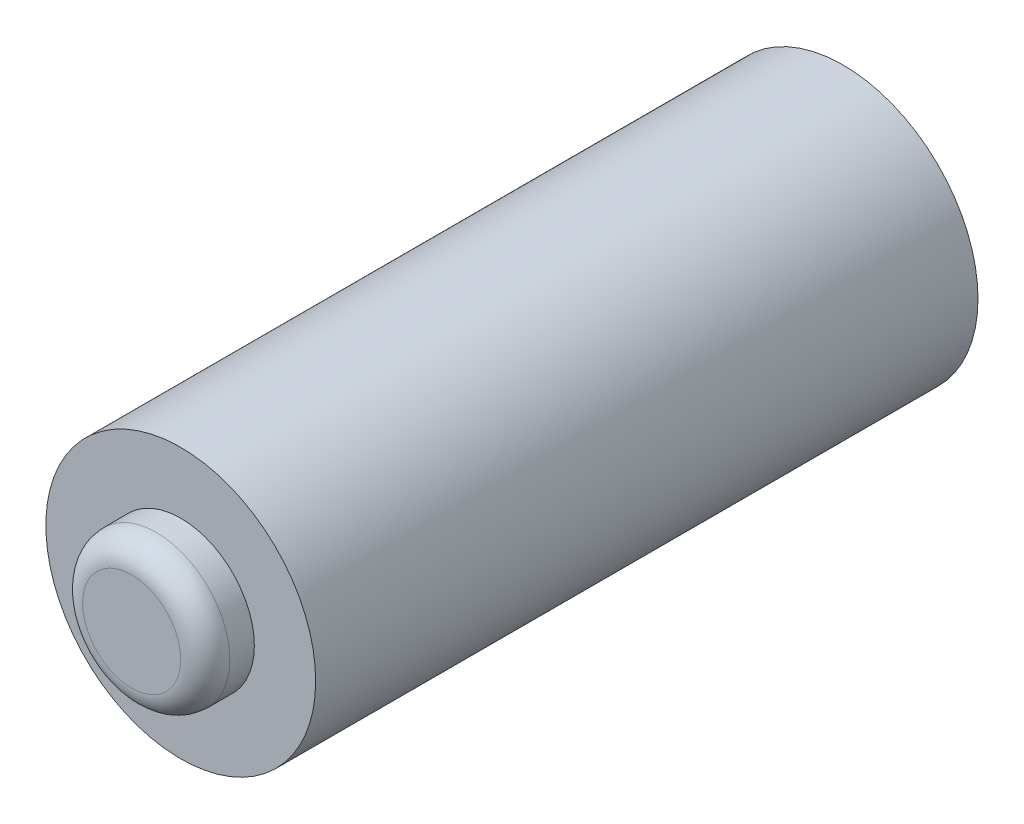
ISO-10303-21;
HEADER;
FILE_DESCRIPTION(('STEP AP214'),'2;1');
FILE_NAME('part.step','',(''),(''),'','','');
FILE_SCHEMA(('AUTOMOTIVE_DESIGN { 1 0 10303 214 1 1 1 1 }'));
ENDSEC;
DATA;
#1=APPLICATION_CONTEXT('core data for automotive mechanical design processes');
#2=APPLICATION_PROTOCOL_DEFINITION('international standard','automotive_design',2000,#1);
#3=PRODUCT_CONTEXT('',#1,'mechanical');
#4=PRODUCT('Part','Part','',(#3));
#5=PRODUCT_RELATED_PRODUCT_CATEGORY('part','',(#4));
#6=PRODUCT_DEFINITION_FORMATION('','',#4);
#7=PRODUCT_DEFINITION_CONTEXT('part definition',#1,'design');
#8=PRODUCT_DEFINITION('design','',#6,#7);
#9=PRODUCT_DEFINITION_SHAPE('','',#8);
#10=(LENGTH_UNIT() NAMED_UNIT(*) SI_UNIT(.MILLI.,.METRE.));
#11=(NAMED_UNIT(*) PLANE_ANGLE_UNIT() SI_UNIT($,.RADIAN.));
#12=(NAMED_UNIT(*) SI_UNIT($,.STERADIAN.) SOLID_ANGLE_UNIT());
#13=UNCERTAINTY_MEASURE_WITH_UNIT(LENGTH_MEASURE(1.E-05),#10,'distance_accuracy_value','');
#14=(GEOMETRIC_REPRESENTATION_CONTEXT(3) GLOBAL_UNCERTAINTY_ASSIGNED_CONTEXT((#13)) GLOBAL_UNIT_ASSIGNED_CONTEXT((#10,
#11,#12)) REPRESENTATION_CONTEXT('',''));
#15=CARTESIAN_POINT('',(0.,0.,0.));
#16=DIRECTION('',(0.,0.,1.));
#17=DIRECTION('',(1.,0.,0.));
#18=AXIS2_PLACEMENT_3D('',#15,#16,#17);
#19=CARTESIAN_POINT('',(0.,0.,13.5));
#20=DIRECTION('',(0.,0.,-1.));
#21=DIRECTION('',(-1.,0.,0.));
#22=AXIS2_PLACEMENT_3D('',#19,#20,#21);
#23=CYLINDRICAL_SURFACE('',#22,2.75);
#24=CARTESIAN_POINT('',(0.,0.,13.5));
#25=DIRECTION('',(0.,0.,1.));
#26=DIRECTION('',(1.,0.,0.));
#27=AXIS2_PLACEMENT_3D('',#24,#25,#26);
#28=CIRCLE('',#27,2.75);
#29=CARTESIAN_POINT('',(2.75,0.,13.5));
#30=VERTEX_POINT('',#29);
#31=EDGE_CURVE('E80',#30,#30,#28,.T.);
#32=ORIENTED_EDGE('',*,*,#31,.F.);
#33=EDGE_LOOP('',(#32));
#34=FACE_BOUND('',#33,.T.);
#35=CARTESIAN_POINT('',(0.,0.,0.));
#36=DIRECTION('',(0.,0.,1.));
#37=DIRECTION('',(1.,0.,0.));
#38=AXIS2_PLACEMENT_3D('',#35,#36,#37);
#39=CIRCLE('',#38,2.75);
#40=CARTESIAN_POINT('',(2.75,0.,0.));
#41=VERTEX_POINT('',#40);
#42=EDGE_CURVE('E84',#41,#41,#39,.T.);
#43=ORIENTED_EDGE('',*,*,#42,.T.);
#44=EDGE_LOOP('',(#43));
#45=FACE_BOUND('',#44,.T.);
#46=ADVANCED_FACE('F42',(#34,#45),#23,.T.);
#47=CARTESIAN_POINT('',(0.,0.,13.5));
#48=DIRECTION('',(0.,0.,1.));
#49=DIRECTION('',(1.,0.,0.));
#50=AXIS2_PLACEMENT_3D('',#47,#48,#49);
#51=PLANE('',#50);
#52=CARTESIAN_POINT('',(0.,0.,13.5));
#53=DIRECTION('',(0.,0.,1.));
#54=DIRECTION('',(1.,0.,0.));
#55=AXIS2_PLACEMENT_3D('',#52,#53,#54);
#56=CIRCLE('',#55,1.5);
#57=CARTESIAN_POINT('',(1.5,0.,13.5));
#58=VERTEX_POINT('',#57);
#59=EDGE_CURVE('E76',#58,#58,#56,.T.);
#60=ORIENTED_EDGE('',*,*,#59,.F.);
#61=EDGE_LOOP('',(#60));
#62=FACE_BOUND('',#61,.T.);
#63=ORIENTED_EDGE('',*,*,#31,.T.);
#64=EDGE_LOOP('',(#63));
#65=FACE_BOUND('',#64,.T.);
#66=ADVANCED_FACE('F117',(#62,#65),#51,.T.);
#67=CARTESIAN_POINT('',(0.,0.,0.));
#68=DIRECTION('',(0.,0.,1.));
#69=DIRECTION('',(1.,0.,0.));
#70=AXIS2_PLACEMENT_3D('',#67,#68,#69);
#71=PLANE('',#70);
#72=CARTESIAN_POINT('',(0.,0.,0.));
#73=DIRECTION('',(0.,0.,-1.));
#74=DIRECTION('',(-1.,0.,0.));
#75=AXIS2_PLACEMENT_3D('',#72,#73,#74);
#76=CIRCLE('',#75,1.5);
#77=CARTESIAN_POINT('',(-1.5,0.,0.));
#78=VERTEX_POINT('',#77);
#79=EDGE_CURVE('E62',#78,#78,#76,.T.);
#80=ORIENTED_EDGE('',*,*,#79,.F.);
#81=EDGE_LOOP('',(#80));
#82=FACE_BOUND('',#81,.T.);
#83=ORIENTED_EDGE('',*,*,#42,.F.);
#84=EDGE_LOOP('',(#83));
#85=FACE_BOUND('',#84,.T.);
#86=ADVANCED_FACE('F115',(#82,#85),#71,.F.);
#87=CARTESIAN_POINT('',(0.,0.,14.5));
#88=DIRECTION('',(0.,0.,-1.));
#89=DIRECTION('',(-1.,0.,0.));
#90=AXIS2_PLACEMENT_3D('',#87,#88,#89);
#91=CYLINDRICAL_SURFACE('',#90,1.5);
#92=CARTESIAN_POINT('',(1.5,0.,14.));
#93=CARTESIAN_POINT('',(1.5,0.196349526304931,14.));
#94=CARTESIAN_POINT('',(1.46095900943656,0.392621839976234,14.));
#95=CARTESIAN_POINT('',(1.3106795880973,0.755428457119036,14.));
#96=CARTESIAN_POINT('',(1.19950025331284,0.9218200902468,14.));
#97=CARTESIAN_POINT('',(0.9218200902468,1.19950025331284,14.));
#98=CARTESIAN_POINT('',(0.7554284571191,1.31067958809728,14.));
#99=CARTESIAN_POINT('',(0.392621839976168,1.46095900943658,14.));
#100=CARTESIAN_POINT('',(0.196349526304952,1.5,14.));
#101=CARTESIAN_POINT('',(-0.196349526304952,1.5,14.));
#102=CARTESIAN_POINT('',(-0.392621839976203,1.46095900943657,14.));
#103=CARTESIAN_POINT('',(-0.755428457119068,1.31067958809729,14.));
#104=CARTESIAN_POINT('',(-0.92182009024681,1.19950025331283,14.));
#105=CARTESIAN_POINT('',(-1.19950025331283,0.921820090246809,14.));
#106=CARTESIAN_POINT('',(-1.31067958809729,0.755428457119068,14.));
#107=CARTESIAN_POINT('',(-1.46095900943657,0.392621839976206,14.));
#108=CARTESIAN_POINT('',(-1.5,0.196349526305006,14.));
#109=CARTESIAN_POINT('',(-1.5,-0.196349526305006,14.));
#110=CARTESIAN_POINT('',(-1.46095900943657,-0.392621839976208,14.));
#111=CARTESIAN_POINT('',(-1.3106795880973,-0.755428457119058,14.));
#112=CARTESIAN_POINT('',(-1.19950025331282,-0.921820090246821,14.));
#113=CARTESIAN_POINT('',(-0.921820090246818,-1.19950025331282,14.));
#114=CARTESIAN_POINT('',(-0.755428457119058,-1.3106795880973,14.));
#115=CARTESIAN_POINT('',(-0.392621839976214,-1.46095900943656,14.));
#116=CARTESIAN_POINT('',(-0.196349526304949,-1.5,14.));
#117=CARTESIAN_POINT('',(0.196349526304955,-1.5,14.));
#118=CARTESIAN_POINT('',(0.392621839976217,-1.46095900943656,14.));
#119=CARTESIAN_POINT('',(0.755428457119049,-1.3106795880973,14.));
#120=CARTESIAN_POINT('',(0.921820090246828,-1.19950025331281,14.));
#121=CARTESIAN_POINT('',(1.19950025331281,-0.921820090246834,14.));
#122=CARTESIAN_POINT('',(1.31067958809729,-0.755428457119069,14.));
#123=CARTESIAN_POINT('',(1.46095900943657,-0.392621839976204,14.));
#124=CARTESIAN_POINT('',(1.5,-0.19634952630493,14.));
#125=CARTESIAN_POINT('',(1.5,0.,14.));
#126=(BOUNDED_CURVE() B_SPLINE_CURVE(3,(#92,#93,#94,#95,#96,#97,#98,#99,#100,#101,#102,#103,
#104,#105,#106,#107,#108,#109,#110,#111,#112,#113,#114,#115,#116,#117,#118,#119,#120,#121,#122,
#123,#124,#125),.UNSPECIFIED.,.T.,.F.) B_SPLINE_CURVE_WITH_KNOTS((4,2,2,2,2,2,2,2,2,2,2,2,2,2,2,
2,4),(0.,0.392699081698724,0.785398163397448,1.17809724509617,1.5707963267949,1.96349540849362,
2.35619449019234,2.74889357189107,3.14159265358979,3.53429173528852,3.92699081698724,
4.31968989868597,4.71238898038469,5.10508806208341,5.49778714378214,5.89048622548086,
6.28318530717959),
.UNSPECIFIED.) CURVE() GEOMETRIC_REPRESENTATION_ITEM() RATIONAL_B_SPLINE_CURVE((1.,1.,1.,1.,1.,
1.,1.,1.,1.,1.,1.,1.,1.,1.,1.,1.,1.,1.,1.,1.,1.,1.,1.,1.,1.,1.,1.,1.,1.,1.,1.,1.,1.,1.)) REPRESENTATION_ITEM(''));
#127=CARTESIAN_POINT('',(1.5,0.,14.));
#128=VERTEX_POINT('',#127);
#129=EDGE_CURVE('E68',#128,#128,#126,.F.);
#130=ORIENTED_EDGE('',*,*,#129,.T.);
#131=EDGE_LOOP('',(#130));
#132=FACE_BOUND('',#131,.T.);
#133=ORIENTED_EDGE('',*,*,#59,.T.);
#134=EDGE_LOOP('',(#133));
#135=FACE_BOUND('',#134,.T.);
#136=ADVANCED_FACE('F108',(#132,#135),#91,.T.);
#137=CARTESIAN_POINT('',(0.,0.,14.5));
#138=DIRECTION('',(0.,0.,1.));
#139=DIRECTION('',(1.,0.,0.));
#140=AXIS2_PLACEMENT_3D('',#137,#138,#139);
#141=PLANE('',#140);
#142=CARTESIAN_POINT('',(1.,0.,14.5));
#143=CARTESIAN_POINT('',(0.999999999999958,-0.130899684203318,14.5));
#144=CARTESIAN_POINT('',(0.973972672957702,-0.261747893317466,14.5));
#145=CARTESIAN_POINT('',(0.873786392064871,-0.503618971412716,14.5));
#146=CARTESIAN_POINT('',(0.799666835541869,-0.614546726831226,14.5));
#147=CARTESIAN_POINT('',(0.614546726831222,-0.799666835541873,14.5));
#148=CARTESIAN_POINT('',(0.503618971412708,-0.873786392064872,14.5));
#149=CARTESIAN_POINT('',(0.261747893317469,-0.973972672957703,14.5));
#150=CARTESIAN_POINT('',(0.130899684203303,-1.,14.5));
#151=CARTESIAN_POINT('',(-0.1308996842033,-1.,14.5));
#152=CARTESIAN_POINT('',(-0.261747893317472,-0.973972672957724,14.5));
#153=CARTESIAN_POINT('',(-0.503618971412711,-0.873786392064849,14.5));
#154=CARTESIAN_POINT('',(-0.614546726831213,-0.799666835541872,14.5));
#155=CARTESIAN_POINT('',(-0.799666835541882,-0.614546726831224,14.5));
#156=CARTESIAN_POINT('',(-0.873786392064861,-0.503618971412703,14.5));
#157=CARTESIAN_POINT('',(-0.973972672957714,-0.261747893317474,14.5));
#158=CARTESIAN_POINT('',(-1.,-0.130899684203301,14.5));
#159=CARTESIAN_POINT('',(-1.,0.130899684203301,14.5));
#160=CARTESIAN_POINT('',(-0.973972672957723,0.261747893317477,14.5));
#161=CARTESIAN_POINT('',(-0.873786392064849,0.503618971412705,14.5));
#162=CARTESIAN_POINT('',(-0.799666835541883,0.614546726831213,14.5));
#163=CARTESIAN_POINT('',(-0.614546726831214,0.799666835541882,14.5));
#164=CARTESIAN_POINT('',(-0.50361897141272,0.873786392064871,14.5));
#165=CARTESIAN_POINT('',(-0.26174789331746,0.973972672957703,14.5));
#166=CARTESIAN_POINT('',(-0.130899684203301,1.,14.5));
#167=CARTESIAN_POINT('',(0.130899684203301,1.,14.5));
#168=CARTESIAN_POINT('',(0.261747893317465,0.973972672957724,14.5));
#169=CARTESIAN_POINT('',(0.503618971412714,0.87378639206485,14.5));
#170=CARTESIAN_POINT('',(0.614546726831229,0.799666835541888,14.5));
#171=CARTESIAN_POINT('',(0.799666835541867,0.614546726831207,14.5));
#172=CARTESIAN_POINT('',(0.873786392064875,0.50361897141271,14.5));
#173=CARTESIAN_POINT('',(0.973972672957699,0.26174789331747,14.5));
#174=CARTESIAN_POINT('',(1.00000000000004,0.130899684203318,14.5));
#175=CARTESIAN_POINT('',(1.,0.,14.5));
#176=(BOUNDED_CURVE() B_SPLINE_CURVE(3,(#142,#143,#144,#145,#146,#147,#148,#149,#150,#151,#152,
#153,#154,#155,#156,#157,#158,#159,#160,#161,#162,#163,#164,#165,#166,#167,#168,#169,#170,#171,
#172,#173,#174,#175),.UNSPECIFIED.,.T.,.F.) B_SPLINE_CURVE_WITH_KNOTS((4,2,2,2,2,2,2,2,2,2,2,2,
2,2,2,2,4),(0.,0.392699081698725,0.785398163397448,1.17809724509617,1.5707963267949,
1.96349540849362,2.35619449019234,2.74889357189107,3.14159265358979,3.53429173528852,
3.92699081698724,4.31968989868597,4.71238898038469,5.10508806208341,5.49778714378214,
5.89048622548086,6.28318530717959),
.UNSPECIFIED.) CURVE() GEOMETRIC_REPRESENTATION_ITEM() RATIONAL_B_SPLINE_CURVE((1.,1.,1.,1.,1.,
1.,1.,1.,1.,1.,1.,1.,1.,1.,1.,1.,1.,1.,1.,1.,1.,1.,1.,1.,1.,1.,1.,1.,1.,1.,1.,1.,1.,1.)) REPRESENTATION_ITEM(''));
#177=CARTESIAN_POINT('',(1.,0.,14.5));
#178=VERTEX_POINT('',#177);
#179=EDGE_CURVE('E74',#178,#178,#176,.F.);
#180=ORIENTED_EDGE('',*,*,#179,.T.);
#181=EDGE_LOOP('',(#180));
#182=FACE_BOUND('',#181,.T.);
#183=ADVANCED_FACE('F97',(#182),#141,.T.);
#184=CARTESIAN_POINT('',(1.,0.,14.5));
#185=CARTESIAN_POINT('',(1.00000000000004,0.130899684203318,14.5));
#186=CARTESIAN_POINT('',(0.973972672957699,0.26174789331747,14.5));
#187=CARTESIAN_POINT('',(0.873786392064875,0.50361897141271,14.5));
#188=CARTESIAN_POINT('',(0.799666835541867,0.614546726831207,14.5));
#189=CARTESIAN_POINT('',(0.614546726831229,0.799666835541888,14.5));
#190=CARTESIAN_POINT('',(0.503618971412714,0.87378639206485,14.5));
#191=CARTESIAN_POINT('',(0.261747893317465,0.973972672957724,14.5));
#192=CARTESIAN_POINT('',(0.130899684203301,1.,14.5));
#193=CARTESIAN_POINT('',(-0.130899684203301,1.,14.5));
#194=CARTESIAN_POINT('',(-0.26174789331746,0.973972672957703,14.5));
#195=CARTESIAN_POINT('',(-0.50361897141272,0.873786392064871,14.5));
#196=CARTESIAN_POINT('',(-0.614546726831214,0.799666835541882,14.5));
#197=CARTESIAN_POINT('',(-0.799666835541883,0.614546726831213,14.5));
#198=CARTESIAN_POINT('',(-0.873786392064849,0.503618971412705,14.5));
#199=CARTESIAN_POINT('',(-0.973972672957723,0.261747893317477,14.5));
#200=CARTESIAN_POINT('',(-1.,0.130899684203301,14.5));
#201=CARTESIAN_POINT('',(-1.,-0.130899684203301,14.5));
#202=CARTESIAN_POINT('',(-0.973972672957714,-0.261747893317474,14.5));
#203=CARTESIAN_POINT('',(-0.873786392064861,-0.503618971412703,14.5));
#204=CARTESIAN_POINT('',(-0.799666835541882,-0.614546726831224,14.5));
#205=CARTESIAN_POINT('',(-0.614546726831213,-0.799666835541872,14.5));
#206=CARTESIAN_POINT('',(-0.503618971412711,-0.873786392064849,14.5));
#207=CARTESIAN_POINT('',(-0.261747893317472,-0.973972672957724,14.5));
#208=CARTESIAN_POINT('',(-0.1308996842033,-1.,14.5));
#209=CARTESIAN_POINT('',(0.130899684203303,-1.,14.5));
#210=CARTESIAN_POINT('',(0.261747893317469,-0.973972672957703,14.5));
#211=CARTESIAN_POINT('',(0.503618971412708,-0.873786392064872,14.5));
#212=CARTESIAN_POINT('',(0.614546726831222,-0.799666835541873,14.5));
#213=CARTESIAN_POINT('',(0.799666835541869,-0.614546726831226,14.5));
#214=CARTESIAN_POINT('',(0.873786392064871,-0.503618971412716,14.5));
#215=CARTESIAN_POINT('',(0.973972672957702,-0.261747893317466,14.5));
#216=CARTESIAN_POINT('',(0.999999999999958,-0.130899684203318,14.5));
#217=CARTESIAN_POINT('',(1.,0.,14.5));
#218=CARTESIAN_POINT('',(1.5,0.,14.5));
#219=CARTESIAN_POINT('',(1.50000000000002,0.196349526304931,14.5));
#220=CARTESIAN_POINT('',(1.46095900943654,0.392621839976226,14.5));
#221=CARTESIAN_POINT('',(1.31067958809732,0.755428457119043,14.5));
#222=CARTESIAN_POINT('',(1.19950025331283,0.921820090246789,14.5));
#223=CARTESIAN_POINT('',(0.921820090246811,1.19950025331285,14.5));
#224=CARTESIAN_POINT('',(0.7554284571191,1.31067958809725,14.5));
#225=CARTESIAN_POINT('',(0.392621839976168,1.46095900943661,14.5));
#226=CARTESIAN_POINT('',(0.196349526304952,1.5,14.5));
#227=CARTESIAN_POINT('',(-0.196349526304952,1.5,14.5));
#228=CARTESIAN_POINT('',(-0.39262183997619,1.46095900943656,14.5));
#229=CARTESIAN_POINT('',(-0.75542845711908,1.3106795880973,14.5));
#230=CARTESIAN_POINT('',(-0.92182009024681,1.19950025331283,14.5));
#231=CARTESIAN_POINT('',(-1.19950025331283,0.921820090246809,14.5));
#232=CARTESIAN_POINT('',(-1.31067958809727,0.755428457119061,14.5));
#233=CARTESIAN_POINT('',(-1.46095900943659,0.392621839976213,14.5));
#234=CARTESIAN_POINT('',(-1.5,0.196349526305006,14.5));
#235=CARTESIAN_POINT('',(-1.5,-0.196349526305006,14.5));
#236=CARTESIAN_POINT('',(-1.46095900943654,-0.39262183997621,14.5));
#237=CARTESIAN_POINT('',(-1.31067958809732,-0.755428457119057,14.5));
#238=CARTESIAN_POINT('',(-1.19950025331281,-0.92182009024681,14.5));
#239=CARTESIAN_POINT('',(-0.921820090246829,-1.19950025331283,14.5));
#240=CARTESIAN_POINT('',(-0.755428457119049,-1.31067958809727,14.5));
#241=CARTESIAN_POINT('',(-0.392621839976223,-1.46095900943659,14.5));
#242=CARTESIAN_POINT('',(-0.196349526304949,-1.5,14.5));
#243=CARTESIAN_POINT('',(0.196349526304955,-1.5,14.5));
#244=CARTESIAN_POINT('',(0.392621839976209,-1.46095900943654,14.5));
#245=CARTESIAN_POINT('',(0.755428457119056,-1.31067958809732,14.5));
#246=CARTESIAN_POINT('',(0.921820090246807,-1.19950025331281,14.5));
#247=CARTESIAN_POINT('',(1.19950025331283,-0.921820090246833,14.5));
#248=CARTESIAN_POINT('',(1.3106795880973,-0.75542845711906,14.5));
#249=CARTESIAN_POINT('',(1.46095900943656,-0.392621839976212,14.5));
#250=CARTESIAN_POINT('',(1.49999999999998,-0.19634952630493,14.5));
#251=CARTESIAN_POINT('',(1.5,0.,14.5));
#252=CARTESIAN_POINT('',(1.5,0.,14.));
#253=CARTESIAN_POINT('',(1.5,0.196349526304931,14.));
#254=CARTESIAN_POINT('',(1.46095900943656,0.392621839976234,14.));
#255=CARTESIAN_POINT('',(1.3106795880973,0.755428457119036,14.));
#256=CARTESIAN_POINT('',(1.19950025331284,0.9218200902468,14.));
#257=CARTESIAN_POINT('',(0.9218200902468,1.19950025331284,14.));
#258=CARTESIAN_POINT('',(0.7554284571191,1.31067958809728,14.));
#259=CARTESIAN_POINT('',(0.392621839976168,1.46095900943658,14.));
#260=CARTESIAN_POINT('',(0.196349526304952,1.5,14.));
#261=CARTESIAN_POINT('',(-0.196349526304952,1.5,14.));
#262=CARTESIAN_POINT('',(-0.392621839976203,1.46095900943657,14.));
#263=CARTESIAN_POINT('',(-0.755428457119068,1.31067958809729,14.));
#264=CARTESIAN_POINT('',(-0.92182009024681,1.19950025331283,14.));
#265=CARTESIAN_POINT('',(-1.19950025331283,0.921820090246809,14.));
#266=CARTESIAN_POINT('',(-1.31067958809729,0.755428457119068,14.));
#267=CARTESIAN_POINT('',(-1.46095900943657,0.392621839976206,14.));
#268=CARTESIAN_POINT('',(-1.5,0.196349526305006,14.));
#269=CARTESIAN_POINT('',(-1.5,-0.196349526305006,14.));
#270=CARTESIAN_POINT('',(-1.46095900943657,-0.392621839976208,14.));
#271=CARTESIAN_POINT('',(-1.3106795880973,-0.755428457119058,14.));
#272=CARTESIAN_POINT('',(-1.19950025331282,-0.921820090246821,14.));
#273=CARTESIAN_POINT('',(-0.921820090246818,-1.19950025331282,14.));
#274=CARTESIAN_POINT('',(-0.755428457119058,-1.3106795880973,14.));
#275=CARTESIAN_POINT('',(-0.392621839976214,-1.46095900943656,14.));
#276=CARTESIAN_POINT('',(-0.196349526304949,-1.5,14.));
#277=CARTESIAN_POINT('',(0.196349526304955,-1.5,14.));
#278=CARTESIAN_POINT('',(0.392621839976217,-1.46095900943656,14.));
#279=CARTESIAN_POINT('',(0.755428457119049,-1.3106795880973,14.));
#280=CARTESIAN_POINT('',(0.921820090246828,-1.19950025331281,14.));
#281=CARTESIAN_POINT('',(1.19950025331281,-0.921820090246834,14.));
#282=CARTESIAN_POINT('',(1.31067958809729,-0.755428457119069,14.));
#283=CARTESIAN_POINT('',(1.46095900943657,-0.392621839976204,14.));
#284=CARTESIAN_POINT('',(1.5,-0.19634952630493,14.));
#285=CARTESIAN_POINT('',(1.5,0.,14.));
#286=(BOUNDED_SURFACE() B_SPLINE_SURFACE(2,3,((#184,#185,#186,#187,#188,#189,#190,#191,#192,
#193,#194,#195,#196,#197,#198,#199,#200,#201,#202,#203,#204,#205,#206,#207,#208,#209,#210,#211,
#212,#213,#214,#215,#216,#217),(#218,#219,#220,#221,#222,#223,#224,#225,#226,#227,#228,#229,
#230,#231,#232,#233,#234,#235,#236,#237,#238,#239,#240,#241,#242,#243,#244,#245,#246,#247,#248,
#249,#250,#251),(#252,#253,#254,#255,#256,#257,#258,#259,#260,#261,#262,#263,#264,#265,#266,
#267,#268,#269,#270,#271,#272,#273,#274,#275,#276,#277,#278,#279,#280,#281,#282,#283,#284,
#285)),.UNSPECIFIED.,.F.,.T.,.F.) B_SPLINE_SURFACE_WITH_KNOTS((3,3),(4,2,2,2,2,2,2,2,2,2,2,2,2,
2,2,2,4),(0.,1.),(0.,0.392699081698724,0.785398163397448,1.17809724509617,1.5707963267949,
1.96349540849362,2.35619449019234,2.74889357189107,3.14159265358979,3.53429173528852,
3.92699081698724,4.31968989868597,4.71238898038469,5.10508806208341,5.49778714378214,
5.89048622548086,6.28318530717959),
.UNSPECIFIED.) GEOMETRIC_REPRESENTATION_ITEM() RATIONAL_B_SPLINE_SURFACE(((1.,1.,1.,1.,1.,1.,1.,
1.,1.,1.,1.,1.,1.,1.,1.,1.,1.,1.,1.,1.,1.,1.,1.,1.,1.,1.,1.,1.,1.,1.,1.,1.,1.,1.),
(0.707106781186548,0.707106781186548,0.707106781186548,0.707106781186548,0.707106781186548,
0.707106781186548,0.707106781186548,0.707106781186548,0.707106781186548,0.707106781186548,
0.707106781186547,0.707106781186547,0.707106781186548,0.707106781186548,0.707106781186548,
0.707106781186548,0.707106781186548,0.707106781186548,0.707106781186548,0.707106781186548,
0.707106781186548,0.707106781186548,0.707106781186548,0.707106781186548,0.707106781186548,
0.707106781186548,0.707106781186548,0.707106781186548,0.707106781186548,0.707106781186548,
0.707106781186548,0.707106781186548,0.707106781186548,0.707106781186548),(1.,1.,1.,1.,1.,1.,1.,
1.,1.,1.,1.,1.,1.,1.,1.,1.,1.,1.,1.,1.,1.,1.,1.,1.,1.,1.,1.,1.,1.,1.,1.,1.,1.,1.))) REPRESENTATION_ITEM('') SURFACE());
#287=ORIENTED_EDGE('',*,*,#129,.F.);
#288=EDGE_LOOP('',(#287));
#289=FACE_BOUND('',#288,.T.);
#290=ORIENTED_EDGE('',*,*,#179,.F.);
#291=EDGE_LOOP('',(#290));
#292=FACE_BOUND('',#291,.T.);
#293=ADVANCED_FACE('F107',(#289,#292),#286,.T.);
#294=CARTESIAN_POINT('',(0.,0.,-1.));
#295=DIRECTION('',(0.,0.,1.));
#296=DIRECTION('',(1.,0.,0.));
#297=AXIS2_PLACEMENT_3D('',#294,#295,#296);
#298=CYLINDRICAL_SURFACE('',#297,1.5);
#299=CARTESIAN_POINT('',(-1.5,0.,-0.5));
#300=CARTESIAN_POINT('',(-1.5,0.196349526304931,-0.500000000000032));
#301=CARTESIAN_POINT('',(-1.46095900943656,0.392621839976234,-0.5));
#302=CARTESIAN_POINT('',(-1.3106795880973,0.755428457119036,-0.5));
#303=CARTESIAN_POINT('',(-1.19950025331284,0.9218200902468,-0.5));
#304=CARTESIAN_POINT('',(-0.9218200902468,1.19950025331284,-0.5));
#305=CARTESIAN_POINT('',(-0.7554284571191,1.31067958809728,-0.5));
#306=CARTESIAN_POINT('',(-0.392621839976168,1.46095900943658,-0.5));
#307=CARTESIAN_POINT('',(-0.196349526304952,1.5,-0.5));
#308=CARTESIAN_POINT('',(0.196349526304952,1.5,-0.5));
#309=CARTESIAN_POINT('',(0.392621839976203,1.46095900943657,-0.5));
#310=CARTESIAN_POINT('',(0.755428457119068,1.31067958809729,-0.5));
#311=CARTESIAN_POINT('',(0.92182009024681,1.19950025331283,-0.5));
#312=CARTESIAN_POINT('',(1.19950025331283,0.921820090246809,-0.5));
#313=CARTESIAN_POINT('',(1.31067958809729,0.755428457119068,-0.5));
#314=CARTESIAN_POINT('',(1.46095900943657,0.392621839976206,-0.5));
#315=CARTESIAN_POINT('',(1.5,0.196349526305006,-0.5));
#316=CARTESIAN_POINT('',(1.5,-0.196349526305006,-0.5));
#317=CARTESIAN_POINT('',(1.46095900943657,-0.392621839976208,-0.5));
#318=CARTESIAN_POINT('',(1.3106795880973,-0.755428457119058,-0.5));
#319=CARTESIAN_POINT('',(1.19950025331282,-0.921820090246821,-0.5));
#320=CARTESIAN_POINT('',(0.921820090246818,-1.19950025331282,-0.5));
#321=CARTESIAN_POINT('',(0.755428457119058,-1.3106795880973,-0.5));
#322=CARTESIAN_POINT('',(0.392621839976214,-1.46095900943656,-0.5));
#323=CARTESIAN_POINT('',(0.196349526304949,-1.5,-0.5));
#324=CARTESIAN_POINT('',(-0.196349526304955,-1.5,-0.5));
#325=CARTESIAN_POINT('',(-0.392621839976217,-1.46095900943656,-0.5));
#326=CARTESIAN_POINT('',(-0.755428457119049,-1.3106795880973,-0.5));
#327=CARTESIAN_POINT('',(-0.921820090246828,-1.19950025331281,-0.5));
#328=CARTESIAN_POINT('',(-1.19950025331281,-0.921820090246834,-0.5));
#329=CARTESIAN_POINT('',(-1.31067958809729,-0.755428457119069,-0.5));
#330=CARTESIAN_POINT('',(-1.46095900943657,-0.392621839976204,-0.5));
#331=CARTESIAN_POINT('',(-1.5,-0.19634952630493,-0.499999999999968));
#332=CARTESIAN_POINT('',(-1.5,0.,-0.5));
#333=(BOUNDED_CURVE() B_SPLINE_CURVE(3,(#299,#300,#301,#302,#303,#304,#305,#306,#307,#308,#309,
#310,#311,#312,#313,#314,#315,#316,#317,#318,#319,#320,#321,#322,#323,#324,#325,#326,#327,#328,
#329,#330,#331,#332),.UNSPECIFIED.,.T.,.F.) B_SPLINE_CURVE_WITH_KNOTS((4,2,2,2,2,2,2,2,2,2,2,2,
2,2,2,2,4),(0.,0.392699081698724,0.785398163397448,1.17809724509617,1.5707963267949,
1.96349540849362,2.35619449019234,2.74889357189107,3.14159265358979,3.53429173528852,
3.92699081698724,4.31968989868597,4.71238898038469,5.10508806208341,5.49778714378214,
5.89048622548086,6.28318530717959),
.UNSPECIFIED.) CURVE() GEOMETRIC_REPRESENTATION_ITEM() RATIONAL_B_SPLINE_CURVE((1.,1.,1.,1.,1.,
1.,1.,1.,1.,1.,1.,1.,1.,1.,1.,1.,1.,1.,1.,1.,1.,1.,1.,1.,1.,1.,1.,1.,1.,1.,1.,1.,1.,1.)) REPRESENTATION_ITEM(''));
#334=CARTESIAN_POINT('',(-1.5,0.,-0.5));
#335=VERTEX_POINT('',#334);
#336=EDGE_CURVE('E11',#335,#335,#333,.F.);
#337=ORIENTED_EDGE('',*,*,#336,.T.);
#338=EDGE_LOOP('',(#337));
#339=FACE_BOUND('',#338,.T.);
#340=ORIENTED_EDGE('',*,*,#79,.T.);
#341=EDGE_LOOP('',(#340));
#342=FACE_BOUND('',#341,.T.);
#343=ADVANCED_FACE('F109',(#339,#342),#298,.T.);
#344=CARTESIAN_POINT('',(0.,0.,-1.));
#345=DIRECTION('',(0.,0.,-1.));
#346=DIRECTION('',(-1.,0.,0.));
#347=AXIS2_PLACEMENT_3D('',#344,#345,#346);
#348=PLANE('',#347);
#349=CARTESIAN_POINT('',(-1.,0.,-1.));
#350=CARTESIAN_POINT('',(-0.999999999999958,-0.130899684203318,-1.));
#351=CARTESIAN_POINT('',(-0.973972672957702,-0.261747893317466,-1.));
#352=CARTESIAN_POINT('',(-0.873786392064871,-0.503618971412716,-1.));
#353=CARTESIAN_POINT('',(-0.799666835541869,-0.614546726831226,-1.));
#354=CARTESIAN_POINT('',(-0.614546726831222,-0.799666835541873,-1.));
#355=CARTESIAN_POINT('',(-0.503618971412708,-0.873786392064872,-1.));
#356=CARTESIAN_POINT('',(-0.261747893317469,-0.973972672957703,-1.));
#357=CARTESIAN_POINT('',(-0.130899684203303,-1.,-1.));
#358=CARTESIAN_POINT('',(0.1308996842033,-1.,-1.));
#359=CARTESIAN_POINT('',(0.261747893317472,-0.973972672957724,-1.));
#360=CARTESIAN_POINT('',(0.503618971412711,-0.873786392064849,-1.));
#361=CARTESIAN_POINT('',(0.614546726831213,-0.799666835541872,-1.));
#362=CARTESIAN_POINT('',(0.799666835541882,-0.614546726831224,-1.));
#363=CARTESIAN_POINT('',(0.873786392064861,-0.503618971412703,-1.));
#364=CARTESIAN_POINT('',(0.973972672957714,-0.261747893317474,-1.));
#365=CARTESIAN_POINT('',(1.,-0.130899684203301,-1.));
#366=CARTESIAN_POINT('',(1.,0.130899684203301,-1.));
#367=CARTESIAN_POINT('',(0.973972672957723,0.261747893317477,-1.));
#368=CARTESIAN_POINT('',(0.873786392064849,0.503618971412705,-1.));
#369=CARTESIAN_POINT('',(0.799666835541883,0.614546726831213,-1.));
#370=CARTESIAN_POINT('',(0.614546726831214,0.799666835541882,-1.));
#371=CARTESIAN_POINT('',(0.50361897141272,0.873786392064871,-1.));
#372=CARTESIAN_POINT('',(0.26174789331746,0.973972672957703,-1.));
#373=CARTESIAN_POINT('',(0.130899684203301,1.,-1.));
#374=CARTESIAN_POINT('',(-0.130899684203301,1.,-1.));
#375=CARTESIAN_POINT('',(-0.261747893317465,0.973972672957724,-1.));
#376=CARTESIAN_POINT('',(-0.503618971412714,0.87378639206485,-1.));
#377=CARTESIAN_POINT('',(-0.614546726831229,0.799666835541888,-1.));
#378=CARTESIAN_POINT('',(-0.799666835541867,0.614546726831207,-1.));
#379=CARTESIAN_POINT('',(-0.873786392064875,0.50361897141271,-1.));
#380=CARTESIAN_POINT('',(-0.973972672957699,0.26174789331747,-1.));
#381=CARTESIAN_POINT('',(-1.00000000000004,0.130899684203318,-1.));
#382=CARTESIAN_POINT('',(-1.,0.,-1.));
#383=(BOUNDED_CURVE() B_SPLINE_CURVE(3,(#349,#350,#351,#352,#353,#354,#355,#356,#357,#358,#359,
#360,#361,#362,#363,#364,#365,#366,#367,#368,#369,#370,#371,#372,#373,#374,#375,#376,#377,#378,
#379,#380,#381,#382),.UNSPECIFIED.,.T.,.F.) B_SPLINE_CURVE_WITH_KNOTS((4,2,2,2,2,2,2,2,2,2,2,2,
2,2,2,2,4),(0.,0.392699081698725,0.785398163397448,1.17809724509617,1.5707963267949,
1.96349540849362,2.35619449019234,2.74889357189107,3.14159265358979,3.53429173528852,
3.92699081698724,4.31968989868597,4.71238898038469,5.10508806208341,5.49778714378214,
5.89048622548086,6.28318530717959),
.UNSPECIFIED.) CURVE() GEOMETRIC_REPRESENTATION_ITEM() RATIONAL_B_SPLINE_CURVE((1.,1.,1.,1.,1.,
1.,1.,1.,1.,1.,1.,1.,1.,1.,1.,1.,1.,1.,1.,1.,1.,1.,1.,1.,1.,1.,1.,1.,1.,1.,1.,1.,1.,1.)) REPRESENTATION_ITEM(''));
#384=CARTESIAN_POINT('',(-1.,0.,-1.));
#385=VERTEX_POINT('',#384);
#386=EDGE_CURVE('E56',#385,#385,#383,.F.);
#387=ORIENTED_EDGE('',*,*,#386,.T.);
#388=EDGE_LOOP('',(#387));
#389=FACE_BOUND('',#388,.T.);
#390=ADVANCED_FACE('F202',(#389),#348,.T.);
#391=CARTESIAN_POINT('',(-1.,0.,-1.));
#392=CARTESIAN_POINT('',(-1.00000000000004,0.130899684203318,-1.));
#393=CARTESIAN_POINT('',(-0.973972672957699,0.26174789331747,-1.));
#394=CARTESIAN_POINT('',(-0.873786392064875,0.50361897141271,-1.));
#395=CARTESIAN_POINT('',(-0.799666835541867,0.614546726831207,-1.));
#396=CARTESIAN_POINT('',(-0.614546726831229,0.799666835541888,-1.));
#397=CARTESIAN_POINT('',(-0.503618971412714,0.87378639206485,-1.));
#398=CARTESIAN_POINT('',(-0.261747893317465,0.973972672957724,-1.));
#399=CARTESIAN_POINT('',(-0.130899684203301,1.,-1.));
#400=CARTESIAN_POINT('',(0.130899684203301,1.,-1.));
#401=CARTESIAN_POINT('',(0.26174789331746,0.973972672957703,-1.));
#402=CARTESIAN_POINT('',(0.50361897141272,0.873786392064871,-1.));
#403=CARTESIAN_POINT('',(0.614546726831214,0.799666835541882,-1.));
#404=CARTESIAN_POINT('',(0.799666835541883,0.614546726831213,-1.));
#405=CARTESIAN_POINT('',(0.873786392064849,0.503618971412705,-1.));
#406=CARTESIAN_POINT('',(0.973972672957723,0.261747893317477,-1.));
#407=CARTESIAN_POINT('',(1.,0.130899684203301,-1.));
#408=CARTESIAN_POINT('',(1.,-0.130899684203301,-1.));
#409=CARTESIAN_POINT('',(0.973972672957714,-0.261747893317474,-1.));
#410=CARTESIAN_POINT('',(0.873786392064861,-0.503618971412703,-1.));
#411=CARTESIAN_POINT('',(0.799666835541882,-0.614546726831224,-1.));
#412=CARTESIAN_POINT('',(0.614546726831213,-0.799666835541872,-1.));
#413=CARTESIAN_POINT('',(0.503618971412711,-0.873786392064849,-1.));
#414=CARTESIAN_POINT('',(0.261747893317472,-0.973972672957724,-1.));
#415=CARTESIAN_POINT('',(0.1308996842033,-1.,-1.));
#416=CARTESIAN_POINT('',(-0.130899684203303,-1.,-1.));
#417=CARTESIAN_POINT('',(-0.261747893317469,-0.973972672957703,-1.));
#418=CARTESIAN_POINT('',(-0.503618971412708,-0.873786392064872,-1.));
#419=CARTESIAN_POINT('',(-0.614546726831222,-0.799666835541873,-1.));
#420=CARTESIAN_POINT('',(-0.799666835541869,-0.614546726831226,-1.));
#421=CARTESIAN_POINT('',(-0.873786392064871,-0.503618971412716,-1.));
#422=CARTESIAN_POINT('',(-0.973972672957702,-0.261747893317466,-1.));
#423=CARTESIAN_POINT('',(-0.999999999999958,-0.130899684203318,-1.));
#424=CARTESIAN_POINT('',(-1.,0.,-1.));
#425=CARTESIAN_POINT('',(-1.5,0.,-1.));
#426=CARTESIAN_POINT('',(-1.50000000000002,0.196349526304931,-1.));
#427=CARTESIAN_POINT('',(-1.46095900943654,0.392621839976226,-1.));
#428=CARTESIAN_POINT('',(-1.31067958809732,0.755428457119043,-1.));
#429=CARTESIAN_POINT('',(-1.19950025331283,0.921820090246789,-1.));
#430=CARTESIAN_POINT('',(-0.921820090246811,1.19950025331285,-1.));
#431=CARTESIAN_POINT('',(-0.7554284571191,1.31067958809725,-1.));
#432=CARTESIAN_POINT('',(-0.392621839976168,1.46095900943661,-1.));
#433=CARTESIAN_POINT('',(-0.196349526304952,1.5,-1.));
#434=CARTESIAN_POINT('',(0.196349526304952,1.5,-1.));
#435=CARTESIAN_POINT('',(0.39262183997619,1.46095900943656,-1.));
#436=CARTESIAN_POINT('',(0.75542845711908,1.3106795880973,-1.));
#437=CARTESIAN_POINT('',(0.92182009024681,1.19950025331283,-1.));
#438=CARTESIAN_POINT('',(1.19950025331283,0.921820090246809,-1.));
#439=CARTESIAN_POINT('',(1.31067958809727,0.755428457119061,-1.));
#440=CARTESIAN_POINT('',(1.46095900943659,0.392621839976213,-1.));
#441=CARTESIAN_POINT('',(1.5,0.196349526305006,-1.));
#442=CARTESIAN_POINT('',(1.5,-0.196349526305006,-1.));
#443=CARTESIAN_POINT('',(1.46095900943654,-0.39262183997621,-1.));
#444=CARTESIAN_POINT('',(1.31067958809732,-0.755428457119057,-1.));
#445=CARTESIAN_POINT('',(1.19950025331281,-0.92182009024681,-1.));
#446=CARTESIAN_POINT('',(0.921820090246829,-1.19950025331283,-1.));
#447=CARTESIAN_POINT('',(0.755428457119049,-1.31067958809727,-1.));
#448=CARTESIAN_POINT('',(0.392621839976223,-1.46095900943659,-1.));
#449=CARTESIAN_POINT('',(0.196349526304949,-1.5,-1.));
#450=CARTESIAN_POINT('',(-0.196349526304955,-1.5,-1.));
#451=CARTESIAN_POINT('',(-0.392621839976209,-1.46095900943654,-1.));
#452=CARTESIAN_POINT('',(-0.755428457119056,-1.31067958809732,-1.));
#453=CARTESIAN_POINT('',(-0.921820090246807,-1.19950025331281,-1.));
#454=CARTESIAN_POINT('',(-1.19950025331283,-0.921820090246833,-1.));
#455=CARTESIAN_POINT('',(-1.3106795880973,-0.75542845711906,-1.));
#456=CARTESIAN_POINT('',(-1.46095900943656,-0.392621839976212,-1.));
#457=CARTESIAN_POINT('',(-1.49999999999998,-0.19634952630493,-1.));
#458=CARTESIAN_POINT('',(-1.5,0.,-1.));
#459=CARTESIAN_POINT('',(-1.5,0.,-0.5));
#460=CARTESIAN_POINT('',(-1.5,0.196349526304931,-0.500000000000032));
#461=CARTESIAN_POINT('',(-1.46095900943656,0.392621839976234,-0.5));
#462=CARTESIAN_POINT('',(-1.3106795880973,0.755428457119036,-0.5));
#463=CARTESIAN_POINT('',(-1.19950025331284,0.9218200902468,-0.5));
#464=CARTESIAN_POINT('',(-0.9218200902468,1.19950025331284,-0.5));
#465=CARTESIAN_POINT('',(-0.7554284571191,1.31067958809728,-0.5));
#466=CARTESIAN_POINT('',(-0.392621839976168,1.46095900943658,-0.5));
#467=CARTESIAN_POINT('',(-0.196349526304952,1.5,-0.5));
#468=CARTESIAN_POINT('',(0.196349526304952,1.5,-0.5));
#469=CARTESIAN_POINT('',(0.392621839976203,1.46095900943657,-0.5));
#470=CARTESIAN_POINT('',(0.755428457119068,1.31067958809729,-0.5));
#471=CARTESIAN_POINT('',(0.92182009024681,1.19950025331283,-0.5));
#472=CARTESIAN_POINT('',(1.19950025331283,0.921820090246809,-0.5));
#473=CARTESIAN_POINT('',(1.31067958809729,0.755428457119068,-0.5));
#474=CARTESIAN_POINT('',(1.46095900943657,0.392621839976206,-0.5));
#475=CARTESIAN_POINT('',(1.5,0.196349526305006,-0.5));
#476=CARTESIAN_POINT('',(1.5,-0.196349526305006,-0.5));
#477=CARTESIAN_POINT('',(1.46095900943657,-0.392621839976208,-0.5));
#478=CARTESIAN_POINT('',(1.3106795880973,-0.755428457119058,-0.5));
#479=CARTESIAN_POINT('',(1.19950025331282,-0.921820090246821,-0.5));
#480=CARTESIAN_POINT('',(0.921820090246818,-1.19950025331282,-0.5));
#481=CARTESIAN_POINT('',(0.755428457119058,-1.3106795880973,-0.5));
#482=CARTESIAN_POINT('',(0.392621839976214,-1.46095900943656,-0.5));
#483=CARTESIAN_POINT('',(0.196349526304949,-1.5,-0.5));
#484=CARTESIAN_POINT('',(-0.196349526304955,-1.5,-0.5));
#485=CARTESIAN_POINT('',(-0.392621839976217,-1.46095900943656,-0.5));
#486=CARTESIAN_POINT('',(-0.755428457119049,-1.3106795880973,-0.5));
#487=CARTESIAN_POINT('',(-0.921820090246828,-1.19950025331281,-0.5));
#488=CARTESIAN_POINT('',(-1.19950025331281,-0.921820090246834,-0.5));
#489=CARTESIAN_POINT('',(-1.31067958809729,-0.755428457119069,-0.5));
#490=CARTESIAN_POINT('',(-1.46095900943657,-0.392621839976204,-0.5));
#491=CARTESIAN_POINT('',(-1.5,-0.19634952630493,-0.499999999999968));
#492=CARTESIAN_POINT('',(-1.5,0.,-0.5));
#493=(BOUNDED_SURFACE() B_SPLINE_SURFACE(2,3,((#391,#392,#393,#394,#395,#396,#397,#398,#399,
#400,#401,#402,#403,#404,#405,#406,#407,#408,#409,#410,#411,#412,#413,#414,#415,#416,#417,#418,
#419,#420,#421,#422,#423,#424),(#425,#426,#427,#428,#429,#430,#431,#432,#433,#434,#435,#436,
#437,#438,#439,#440,#441,#442,#443,#444,#445,#446,#447,#448,#449,#450,#451,#452,#453,#454,#455,
#456,#457,#458),(#459,#460,#461,#462,#463,#464,#465,#466,#467,#468,#469,#470,#471,#472,#473,
#474,#475,#476,#477,#478,#479,#480,#481,#482,#483,#484,#485,#486,#487,#488,#489,#490,#491,
#492)),.UNSPECIFIED.,.F.,.T.,.F.) B_SPLINE_SURFACE_WITH_KNOTS((3,3),(4,2,2,2,2,2,2,2,2,2,2,2,2,
2,2,2,4),(0.,1.),(0.,0.392699081698724,0.785398163397448,1.17809724509617,1.5707963267949,
1.96349540849362,2.35619449019234,2.74889357189107,3.14159265358979,3.53429173528852,
3.92699081698724,4.31968989868597,4.71238898038469,5.10508806208341,5.49778714378214,
5.89048622548086,6.28318530717959),
.UNSPECIFIED.) GEOMETRIC_REPRESENTATION_ITEM() RATIONAL_B_SPLINE_SURFACE(((1.,1.,1.,1.,1.,1.,1.,
1.,1.,1.,1.,1.,1.,1.,1.,1.,1.,1.,1.,1.,1.,1.,1.,1.,1.,1.,1.,1.,1.,1.,1.,1.,1.,1.),
(0.707106781186548,0.707106781186548,0.707106781186548,0.707106781186548,0.707106781186548,
0.707106781186548,0.707106781186548,0.707106781186548,0.707106781186548,0.707106781186548,
0.707106781186547,0.707106781186547,0.707106781186548,0.707106781186548,0.707106781186548,
0.707106781186548,0.707106781186548,0.707106781186548,0.707106781186548,0.707106781186548,
0.707106781186548,0.707106781186548,0.707106781186548,0.707106781186548,0.707106781186548,
0.707106781186548,0.707106781186548,0.707106781186548,0.707106781186548,0.707106781186548,
0.707106781186548,0.707106781186548,0.707106781186548,0.707106781186548),(1.,1.,1.,1.,1.,1.,1.,
1.,1.,1.,1.,1.,1.,1.,1.,1.,1.,1.,1.,1.,1.,1.,1.,1.,1.,1.,1.,1.,1.,1.,1.,1.,1.,1.))) REPRESENTATION_ITEM('') SURFACE());
#494=ORIENTED_EDGE('',*,*,#336,.F.);
#495=EDGE_LOOP('',(#494));
#496=FACE_BOUND('',#495,.T.);
#497=ORIENTED_EDGE('',*,*,#386,.F.);
#498=EDGE_LOOP('',(#497));
#499=FACE_BOUND('',#498,.T.);
#500=ADVANCED_FACE('F45',(#496,#499),#493,.T.);
#501=CLOSED_SHELL('',(#46,#66,#86,#136,#183,#293,#343,#390,#500));
#502=MANIFOLD_SOLID_BREP('B2',#501);
#503=ADVANCED_BREP_SHAPE_REPRESENTATION('',(#18,#502),#14);
#504=SHAPE_DEFINITION_REPRESENTATION(#9,#503);
ENDSEC;
END-ISO-10303-21;
